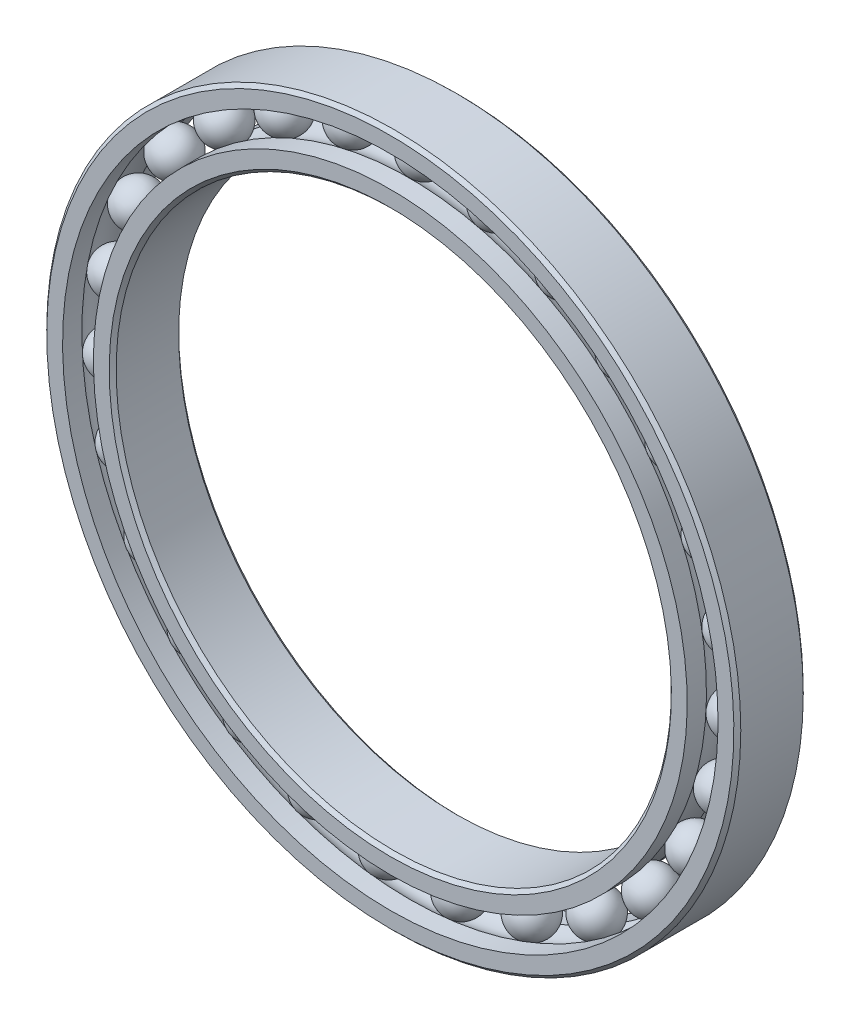
ISO-10303-21;
HEADER;
FILE_DESCRIPTION(('STEP AP214'),'2;1');
FILE_NAME('part.step','',(''),(''),'','','');
FILE_SCHEMA(('AUTOMOTIVE_DESIGN { 1 0 10303 214 1 1 1 1 }'));
ENDSEC;
DATA;
#1=APPLICATION_CONTEXT('core data for automotive mechanical design processes');
#2=APPLICATION_PROTOCOL_DEFINITION('international standard','automotive_design',2000,#1);
#3=PRODUCT_CONTEXT('',#1,'mechanical');
#4=PRODUCT('Part','Part','',(#3));
#5=PRODUCT_RELATED_PRODUCT_CATEGORY('part','',(#4));
#6=PRODUCT_DEFINITION_FORMATION('','',#4);
#7=PRODUCT_DEFINITION_CONTEXT('part definition',#1,'design');
#8=PRODUCT_DEFINITION('design','',#6,#7);
#9=PRODUCT_DEFINITION_SHAPE('','',#8);
#10=(LENGTH_UNIT() NAMED_UNIT(*) SI_UNIT(.MILLI.,.METRE.));
#11=(NAMED_UNIT(*) PLANE_ANGLE_UNIT() SI_UNIT($,.RADIAN.));
#12=(NAMED_UNIT(*) SI_UNIT($,.STERADIAN.) SOLID_ANGLE_UNIT());
#13=UNCERTAINTY_MEASURE_WITH_UNIT(LENGTH_MEASURE(1.E-05),#10,'distance_accuracy_value','');
#14=(GEOMETRIC_REPRESENTATION_CONTEXT(3) GLOBAL_UNCERTAINTY_ASSIGNED_CONTEXT((#13)) GLOBAL_UNIT_ASSIGNED_CONTEXT((#10,
#11,#12)) REPRESENTATION_CONTEXT('',''));
#15=CARTESIAN_POINT('',(0.,0.,0.));
#16=DIRECTION('',(0.,0.,1.));
#17=DIRECTION('',(1.,0.,0.));
#18=AXIS2_PLACEMENT_3D('',#15,#16,#17);
#19=CARTESIAN_POINT('',(10.3777141834092,43.7870191760922,0.));
#20=DIRECTION('',(0.,0.,1.));
#21=DIRECTION('',(0.230615870742427,0.973044870579827,0.));
#22=AXIS2_PLACEMENT_3D('',#19,#20,#21);
#23=SPHERICAL_SURFACE('',#22,3.14269680527354);
#24=CARTESIAN_POINT('',(10.3777141834092,43.7870191760922,3.14269680527354));
#25=VERTEX_POINT('',#24);
#26=VERTEX_LOOP('',#25);
#27=FACE_BOUND('',#26,.T.);
#28=ADVANCED_FACE('F48',(#27),#23,.T.);
#29=CLOSED_SHELL('',(#28));
#30=MANIFOLD_SOLID_BREP('B2',#29);
#31=CARTESIAN_POINT('',(20.1959631090203,40.2134688145538,0.));
#32=DIRECTION('',(0.,0.,1.));
#33=DIRECTION('',(0.448799180200451,0.893632640323418,0.));
#34=AXIS2_PLACEMENT_3D('',#31,#32,#33);
#35=SPHERICAL_SURFACE('',#34,3.14269680527354);
#36=CARTESIAN_POINT('',(20.1959631090203,40.2134688145538,3.14269680527354));
#37=VERTEX_POINT('',#36);
#38=VERTEX_LOOP('',#37);
#39=FACE_BOUND('',#38,.T.);
#40=ADVANCED_FACE('F67',(#39),#35,.T.);
#41=CLOSED_SHELL('',(#40));
#42=MANIFOLD_SOLID_BREP('B6',#41);
#43=CARTESIAN_POINT('',(28.9254424358938,34.4719999403544,0.));
#44=DIRECTION('',(0.,0.,1.));
#45=DIRECTION('',(0.642787609686529,0.766044443118986,0.));
#46=AXIS2_PLACEMENT_3D('',#43,#44,#45);
#47=SPHERICAL_SURFACE('',#46,3.14269680527354);
#48=CARTESIAN_POINT('',(28.9254424358938,34.4719999403544,3.14269680527354));
#49=VERTEX_POINT('',#48);
#50=VERTEX_LOOP('',#49);
#51=FACE_BOUND('',#50,.T.);
#52=ADVANCED_FACE('F86',(#51),#47,.T.);
#53=CLOSED_SHELL('',(#52));
#54=MANIFOLD_SOLID_BREP('B44',#53);
#55=CARTESIAN_POINT('',(36.0955436739766,26.8721366266258,0.));
#56=DIRECTION('',(0.,0.,1.));
#57=DIRECTION('',(0.802123192755037,0.597158591702796,0.));
#58=AXIS2_PLACEMENT_3D('',#55,#56,#57);
#59=SPHERICAL_SURFACE('',#58,3.14269680527354);
#60=CARTESIAN_POINT('',(36.0955436739766,26.8721366266258,3.14269680527354));
#61=VERTEX_POINT('',#60);
#62=VERTEX_LOOP('',#61);
#63=FACE_BOUND('',#62,.T.);
#64=ADVANCED_FACE('F105',(#63),#59,.T.);
#65=CLOSED_SHELL('',(#64));
#66=MANIFOLD_SOLID_BREP('B63',#65);
#67=CARTESIAN_POINT('',(41.3197248096121,17.8235894717625,0.));
#68=DIRECTION('',(0.,0.,1.));
#69=DIRECTION('',(0.91821610688027,0.396079766039167,0.));
#70=AXIS2_PLACEMENT_3D('',#67,#68,#69);
#71=SPHERICAL_SURFACE('',#70,3.14269680527354);
#72=CARTESIAN_POINT('',(41.3197248096121,17.8235894717625,3.14269680527354));
#73=VERTEX_POINT('',#72);
#74=VERTEX_LOOP('',#73);
#75=FACE_BOUND('',#74,.T.);
#76=ADVANCED_FACE('F124',(#75),#71,.T.);
#77=CLOSED_SHELL('',(#76));
#78=MANIFOLD_SOLID_BREP('B82',#77);
#79=CARTESIAN_POINT('',(44.3163488855493,7.81416799501236,0.));
#80=DIRECTION('',(0.,0.,1.));
#81=DIRECTION('',(0.984807753012206,0.173648177666941,0.));
#82=AXIS2_PLACEMENT_3D('',#79,#80,#81);
#83=SPHERICAL_SURFACE('',#82,3.14269680527354);
#84=CARTESIAN_POINT('',(44.3163488855493,7.81416799501236,3.14269680527354));
#85=VERTEX_POINT('',#84);
#86=VERTEX_LOOP('',#85);
#87=FACE_BOUND('',#86,.T.);
#88=ADVANCED_FACE('F143',(#87),#83,.T.);
#89=CLOSED_SHELL('',(#88));
#90=MANIFOLD_SOLID_BREP('B101',#89);
#91=CARTESIAN_POINT('',(44.9238671222071,-2.61651730097095,0.));
#92=DIRECTION('',(0.,0.,1.));
#93=DIRECTION('',(0.998308158271269,-0.0581448289104656,0.));
#94=AXIS2_PLACEMENT_3D('',#91,#92,#93);
#95=SPHERICAL_SURFACE('',#94,3.14269680527354);
#96=CARTESIAN_POINT('',(44.9238671222071,-2.61651730097095,3.14269680527354));
#97=VERTEX_POINT('',#96);
#98=VERTEX_LOOP('',#97);
#99=FACE_BOUND('',#98,.T.);
#100=ADVANCED_FACE('F162',(#99),#95,.T.);
#101=CLOSED_SHELL('',(#100));
#102=MANIFOLD_SOLID_BREP('B120',#101);
#103=CARTESIAN_POINT('',(43.1095280541971,-12.9061454719986,0.));
#104=DIRECTION('',(0.,0.,1.));
#105=DIRECTION('',(0.957989512315492,-0.28680323271108,0.));
#106=AXIS2_PLACEMENT_3D('',#103,#104,#105);
#107=SPHERICAL_SURFACE('',#106,3.14269680527354);
#108=CARTESIAN_POINT('',(43.1095280541971,-12.9061454719986,3.14269680527354));
#109=VERTEX_POINT('',#108);
#110=VERTEX_LOOP('',#109);
#111=FACE_BOUND('',#110,.T.);
#112=ADVANCED_FACE('F181',(#111),#107,.T.);
#113=CLOSED_SHELL('',(#112));
#114=MANIFOLD_SOLID_BREP('B139',#113);
#115=CARTESIAN_POINT('',(38.9711431702999,-22.4999999999996,0.));
#116=DIRECTION('',(0.,0.,1.));
#117=DIRECTION('',(0.866025403784443,-0.499999999999992,0.));
#118=AXIS2_PLACEMENT_3D('',#115,#116,#117);
#119=SPHERICAL_SURFACE('',#118,3.14269680527354);
#120=CARTESIAN_POINT('',(38.9711431702999,-22.4999999999996,3.14269680527353));
#121=VERTEX_POINT('',#120);
#122=VERTEX_LOOP('',#121);
#123=FACE_BOUND('',#122,.T.);
#124=ADVANCED_FACE('F200',(#123),#119,.T.);
#125=CLOSED_SHELL('',(#124));
#126=MANIFOLD_SOLID_BREP('B158',#125);
#127=CARTESIAN_POINT('',(32.7318138707875,-30.8808737040927,0.));
#128=DIRECTION('',(0.,0.,1.));
#129=DIRECTION('',(0.727373641573055,-0.686241637868727,0.));
#130=AXIS2_PLACEMENT_3D('',#127,#128,#129);
#131=SPHERICAL_SURFACE('',#130,3.14269680527354);
#132=CARTESIAN_POINT('',(32.7318138707875,-30.8808737040927,3.14269680527353));
#133=VERTEX_POINT('',#132);
#134=VERTEX_LOOP('',#133);
#135=FACE_BOUND('',#134,.T.);
#136=ADVANCED_FACE('F219',(#135),#131,.T.);
#137=CLOSED_SHELL('',(#136));
#138=MANIFOLD_SOLID_BREP('B177',#137);
#139=CARTESIAN_POINT('',(24.7279040131866,-37.5969515135819,0.));
#140=DIRECTION('',(0.,0.,1.));
#141=DIRECTION('',(0.549508978070813,-0.835487811412932,0.));
#142=AXIS2_PLACEMENT_3D('',#139,#140,#141);
#143=SPHERICAL_SURFACE('',#142,3.14269680527354);
#144=CARTESIAN_POINT('',(24.7279040131866,-37.5969515135819,3.14269680527353));
#145=VERTEX_POINT('',#144);
#146=VERTEX_LOOP('',#145);
#147=FACE_BOUND('',#146,.T.);
#148=ADVANCED_FACE('F240',(#147),#143,.T.);
#149=CLOSED_SHELL('',(#148));
#150=MANIFOLD_SOLID_BREP('B196',#149);
#151=CARTESIAN_POINT('',(15.3909064496554,-42.2861679353658,0.));
#152=DIRECTION('',(0.,0.,1.));
#153=DIRECTION('',(0.342020143325676,-0.939692620785906,0.));
#154=AXIS2_PLACEMENT_3D('',#151,#152,#153);
#155=SPHERICAL_SURFACE('',#154,3.14269680527354);
#156=CARTESIAN_POINT('',(15.3909064496554,-42.2861679353658,3.14269680527353));
#157=VERTEX_POINT('',#156);
#158=VERTEX_LOOP('',#157);
#159=FACE_BOUND('',#158,.T.);
#160=ADVANCED_FACE('F261',(#159),#155,.T.);
#161=CLOSED_SHELL('',(#160));
#162=MANIFOLD_SOLID_BREP('B215',#161);
#163=CARTESIAN_POINT('',(5.22418113563569,-44.6957260983874,0.));
#164=DIRECTION('',(0.,0.,1.));
#165=DIRECTION('',(0.116092914125238,-0.993238357741942,0.));
#166=AXIS2_PLACEMENT_3D('',#163,#164,#165);
#167=SPHERICAL_SURFACE('',#166,3.14269680527354);
#168=CARTESIAN_POINT('',(5.22418113563569,-44.6957260983874,3.14269680527353));
#169=VERTEX_POINT('',#168);
#170=VERTEX_LOOP('',#169);
#171=FACE_BOUND('',#170,.T.);
#172=ADVANCED_FACE('F282',(#171),#167,.T.);
#173=CLOSED_SHELL('',(#172));
#174=MANIFOLD_SOLID_BREP('B236',#173);
#175=CARTESIAN_POINT('',(-5.22418113563505,-44.6957260983875,0.));
#176=DIRECTION('',(0.,0.,1.));
#177=DIRECTION('',(-0.116092914125223,-0.993238357741944,0.));
#178=AXIS2_PLACEMENT_3D('',#175,#176,#177);
#179=SPHERICAL_SURFACE('',#178,3.14269680527354);
#180=CARTESIAN_POINT('',(-5.22418113563505,-44.6957260983875,3.14269680527353));
#181=VERTEX_POINT('',#180);
#182=VERTEX_LOOP('',#181);
#183=FACE_BOUND('',#182,.T.);
#184=ADVANCED_FACE('F303',(#183),#179,.T.);
#185=CLOSED_SHELL('',(#184));
#186=MANIFOLD_SOLID_BREP('B257',#185);
#187=CARTESIAN_POINT('',(-15.3909064496548,-42.286167935366,0.));
#188=DIRECTION('',(0.,0.,1.));
#189=DIRECTION('',(-0.342020143325663,-0.939692620785911,0.));
#190=AXIS2_PLACEMENT_3D('',#187,#188,#189);
#191=SPHERICAL_SURFACE('',#190,3.14269680527354);
#192=CARTESIAN_POINT('',(-15.3909064496548,-42.286167935366,3.14269680527353));
#193=VERTEX_POINT('',#192);
#194=VERTEX_LOOP('',#193);
#195=FACE_BOUND('',#194,.T.);
#196=ADVANCED_FACE('F324',(#195),#191,.T.);
#197=CLOSED_SHELL('',(#196));
#198=MANIFOLD_SOLID_BREP('B278',#197);
#199=CARTESIAN_POINT('',(-24.7279040131861,-37.5969515135823,0.));
#200=DIRECTION('',(0.,0.,1.));
#201=DIRECTION('',(-0.549508978070801,-0.835487811412939,0.));
#202=AXIS2_PLACEMENT_3D('',#199,#200,#201);
#203=SPHERICAL_SURFACE('',#202,3.14269680527354);
#204=CARTESIAN_POINT('',(-24.7279040131861,-37.5969515135823,3.14269680527353));
#205=VERTEX_POINT('',#204);
#206=VERTEX_LOOP('',#205);
#207=FACE_BOUND('',#206,.T.);
#208=ADVANCED_FACE('F345',(#207),#203,.T.);
#209=CLOSED_SHELL('',(#208));
#210=MANIFOLD_SOLID_BREP('B299',#209);
#211=CARTESIAN_POINT('',(-32.731813870787,-30.8808737040932,0.));
#212=DIRECTION('',(0.,0.,1.));
#213=DIRECTION('',(-0.727373641573045,-0.686241637868737,0.));
#214=AXIS2_PLACEMENT_3D('',#211,#212,#213);
#215=SPHERICAL_SURFACE('',#214,3.14269680527354);
#216=CARTESIAN_POINT('',(-32.731813870787,-30.8808737040932,3.14269680527353));
#217=VERTEX_POINT('',#216);
#218=VERTEX_LOOP('',#217);
#219=FACE_BOUND('',#218,.T.);
#220=ADVANCED_FACE('F366',(#219),#215,.T.);
#221=CLOSED_SHELL('',(#220));
#222=MANIFOLD_SOLID_BREP('B320',#221);
#223=CARTESIAN_POINT('',(-38.9711431702996,-22.5000000000002,0.));
#224=DIRECTION('',(0.,0.,1.));
#225=DIRECTION('',(-0.866025403784436,-0.500000000000004,0.));
#226=AXIS2_PLACEMENT_3D('',#223,#224,#225);
#227=SPHERICAL_SURFACE('',#226,3.14269680527354);
#228=CARTESIAN_POINT('',(-38.9711431702996,-22.5000000000002,3.14269680527353));
#229=VERTEX_POINT('',#228);
#230=VERTEX_LOOP('',#229);
#231=FACE_BOUND('',#230,.T.);
#232=ADVANCED_FACE('F387',(#231),#227,.T.);
#233=CLOSED_SHELL('',(#232));
#234=MANIFOLD_SOLID_BREP('B341',#233);
#235=CARTESIAN_POINT('',(-43.109528054197,-12.9061454719992,0.));
#236=DIRECTION('',(0.,0.,1.));
#237=DIRECTION('',(-0.957989512315488,-0.286803232711094,0.));
#238=AXIS2_PLACEMENT_3D('',#235,#236,#237);
#239=SPHERICAL_SURFACE('',#238,3.14269680527354);
#240=CARTESIAN_POINT('',(-43.109528054197,-12.9061454719992,3.14269680527354));
#241=VERTEX_POINT('',#240);
#242=VERTEX_LOOP('',#241);
#243=FACE_BOUND('',#242,.T.);
#244=ADVANCED_FACE('F408',(#243),#239,.T.);
#245=CLOSED_SHELL('',(#244));
#246=MANIFOLD_SOLID_BREP('B362',#245);
#247=CARTESIAN_POINT('',(-44.9238671222071,-2.61651730097158,0.));
#248=DIRECTION('',(0.,0.,1.));
#249=DIRECTION('',(-0.998308158271268,-0.0581448289104796,0.));
#250=AXIS2_PLACEMENT_3D('',#247,#248,#249);
#251=SPHERICAL_SURFACE('',#250,3.14269680527354);
#252=CARTESIAN_POINT('',(-44.9238671222071,-2.61651730097158,3.14269680527354));
#253=VERTEX_POINT('',#252);
#254=VERTEX_LOOP('',#253);
#255=FACE_BOUND('',#254,.T.);
#256=ADVANCED_FACE('F429',(#255),#251,.T.);
#257=CLOSED_SHELL('',(#256));
#258=MANIFOLD_SOLID_BREP('B383',#257);
#259=CARTESIAN_POINT('',(-44.3163488855494,7.81416799501172,0.));
#260=DIRECTION('',(0.,0.,1.));
#261=DIRECTION('',(-0.984807753012209,0.173648177666927,0.));
#262=AXIS2_PLACEMENT_3D('',#259,#260,#261);
#263=SPHERICAL_SURFACE('',#262,3.14269680527354);
#264=CARTESIAN_POINT('',(-44.3163488855494,7.81416799501172,3.14269680527354));
#265=VERTEX_POINT('',#264);
#266=VERTEX_LOOP('',#265);
#267=FACE_BOUND('',#266,.T.);
#268=ADVANCED_FACE('F450',(#267),#263,.T.);
#269=CLOSED_SHELL('',(#268));
#270=MANIFOLD_SOLID_BREP('B404',#269);
#271=CARTESIAN_POINT('',(-41.3197248096124,17.8235894717619,0.));
#272=DIRECTION('',(0.,0.,1.));
#273=DIRECTION('',(-0.918216106880275,0.396079766039154,0.));
#274=AXIS2_PLACEMENT_3D('',#271,#272,#273);
#275=SPHERICAL_SURFACE('',#274,3.14269680527354);
#276=CARTESIAN_POINT('',(-41.3197248096124,17.8235894717619,3.14269680527354));
#277=VERTEX_POINT('',#276);
#278=VERTEX_LOOP('',#277);
#279=FACE_BOUND('',#278,.T.);
#280=ADVANCED_FACE('F471',(#279),#275,.T.);
#281=CLOSED_SHELL('',(#280));
#282=MANIFOLD_SOLID_BREP('B425',#281);
#283=CARTESIAN_POINT('',(-36.095543673977,26.8721366266253,0.));
#284=DIRECTION('',(0.,0.,1.));
#285=DIRECTION('',(-0.802123192755045,0.597158591702785,0.));
#286=AXIS2_PLACEMENT_3D('',#283,#284,#285);
#287=SPHERICAL_SURFACE('',#286,3.14269680527354);
#288=CARTESIAN_POINT('',(-36.095543673977,26.8721366266253,3.14269680527354));
#289=VERTEX_POINT('',#288);
#290=VERTEX_LOOP('',#289);
#291=FACE_BOUND('',#290,.T.);
#292=ADVANCED_FACE('F492',(#291),#287,.T.);
#293=CLOSED_SHELL('',(#292));
#294=MANIFOLD_SOLID_BREP('B446',#293);
#295=CARTESIAN_POINT('',(-28.9254424358943,34.471999940354,0.));
#296=DIRECTION('',(0.,0.,1.));
#297=DIRECTION('',(-0.642787609686541,0.766044443118977,0.));
#298=AXIS2_PLACEMENT_3D('',#295,#296,#297);
#299=SPHERICAL_SURFACE('',#298,3.14269680527354);
#300=CARTESIAN_POINT('',(-28.9254424358943,34.471999940354,3.14269680527354));
#301=VERTEX_POINT('',#300);
#302=VERTEX_LOOP('',#301);
#303=FACE_BOUND('',#302,.T.);
#304=ADVANCED_FACE('F513',(#303),#299,.T.);
#305=CLOSED_SHELL('',(#304));
#306=MANIFOLD_SOLID_BREP('B467',#305);
#307=CARTESIAN_POINT('',(-20.1959631090208,40.2134688145535,0.));
#308=DIRECTION('',(0.,0.,1.));
#309=DIRECTION('',(-0.448799180200463,0.893632640323412,0.));
#310=AXIS2_PLACEMENT_3D('',#307,#308,#309);
#311=SPHERICAL_SURFACE('',#310,3.14269680527354);
#312=CARTESIAN_POINT('',(-20.1959631090208,40.2134688145535,3.14269680527354));
#313=VERTEX_POINT('',#312);
#314=VERTEX_LOOP('',#313);
#315=FACE_BOUND('',#314,.T.);
#316=ADVANCED_FACE('F534',(#315),#311,.T.);
#317=CLOSED_SHELL('',(#316));
#318=MANIFOLD_SOLID_BREP('B488',#317);
#319=CARTESIAN_POINT('',(-10.3777141834098,43.7870191760921,0.));
#320=DIRECTION('',(0.,0.,1.));
#321=DIRECTION('',(-0.230615870742441,0.973044870579824,0.));
#322=AXIS2_PLACEMENT_3D('',#319,#320,#321);
#323=SPHERICAL_SURFACE('',#322,3.14269680527354);
#324=CARTESIAN_POINT('',(-10.3777141834098,43.7870191760921,3.14269680527354));
#325=VERTEX_POINT('',#324);
#326=VERTEX_LOOP('',#325);
#327=FACE_BOUND('',#326,.T.);
#328=ADVANCED_FACE('F555',(#327),#323,.T.);
#329=CLOSED_SHELL('',(#328));
#330=MANIFOLD_SOLID_BREP('B509',#329);
#331=CARTESIAN_POINT('',(0.,45.,0.));
#332=DIRECTION('',(0.,0.,1.));
#333=DIRECTION('',(0.,1.,0.));
#334=AXIS2_PLACEMENT_3D('',#331,#332,#333);
#335=SPHERICAL_SURFACE('',#334,3.14269680527354);
#336=CARTESIAN_POINT('',(0.,45.,3.14269680527354));
#337=VERTEX_POINT('',#336);
#338=VERTEX_LOOP('',#337);
#339=FACE_BOUND('',#338,.T.);
#340=ADVANCED_FACE('F578',(#339),#335,.T.);
#341=CLOSED_SHELL('',(#340));
#342=MANIFOLD_SOLID_BREP('B530',#341);
#343=CARTESIAN_POINT('',(0.,42.7777777777778,5.00000000000003));
#344=DIRECTION('',(0.,0.,-1.));
#345=DIRECTION('',(0.,1.,0.));
#346=AXIS2_PLACEMENT_3D('',#343,#344,#345);
#347=PLANE('',#346);
#348=CARTESIAN_POINT('',(0.,0.,5.00000000000002));
#349=DIRECTION('',(0.,0.,1.));
#350=DIRECTION('',(0.,-1.,0.));
#351=AXIS2_PLACEMENT_3D('',#348,#349,#350);
#352=CIRCLE('',#351,40.5);
#353=CARTESIAN_POINT('',(0.,-40.5,5.00000000000002));
#354=VERTEX_POINT('',#353);
#355=EDGE_CURVE('E626',#354,#354,#352,.T.);
#356=ORIENTED_EDGE('',*,*,#355,.F.);
#357=EDGE_LOOP('',(#356));
#358=FACE_BOUND('',#357,.T.);
#359=CARTESIAN_POINT('',(0.,0.,5.00000000000002));
#360=DIRECTION('',(0.,0.,1.));
#361=DIRECTION('',(0.,-1.,0.));
#362=AXIS2_PLACEMENT_3D('',#359,#360,#361);
#363=CIRCLE('',#362,42.7777777777778);
#364=CARTESIAN_POINT('',(0.,-42.7777777777778,5.00000000000002));
#365=VERTEX_POINT('',#364);
#366=EDGE_CURVE('E577',#365,#365,#363,.T.);
#367=ORIENTED_EDGE('',*,*,#366,.T.);
#368=EDGE_LOOP('',(#367));
#369=FACE_BOUND('',#368,.T.);
#370=ADVANCED_FACE('F598',(#358,#369),#347,.F.);
#371=CARTESIAN_POINT('',(0.,0.,5.00000000000002));
#372=DIRECTION('',(0.,0.,1.));
#373=DIRECTION('',(0.,-1.,0.));
#374=AXIS2_PLACEMENT_3D('',#371,#372,#373);
#375=CYLINDRICAL_SURFACE('',#374,42.7777777777778);
#376=ORIENTED_EDGE('',*,*,#366,.F.);
#377=EDGE_LOOP('',(#376));
#378=FACE_BOUND('',#377,.T.);
#379=CARTESIAN_POINT('',(0.,0.,2.22222222222222));
#380=DIRECTION('',(0.,0.,1.));
#381=DIRECTION('',(0.,-1.,0.));
#382=AXIS2_PLACEMENT_3D('',#379,#380,#381);
#383=CIRCLE('',#382,42.7777777777778);
#384=CARTESIAN_POINT('',(0.,-42.7777777777778,2.22222222222221));
#385=VERTEX_POINT('',#384);
#386=EDGE_CURVE('E604',#385,#385,#383,.T.);
#387=ORIENTED_EDGE('',*,*,#386,.T.);
#388=EDGE_LOOP('',(#387));
#389=FACE_BOUND('',#388,.T.);
#390=ADVANCED_FACE('F633',(#378,#389),#375,.T.);
#391=CARTESIAN_POINT('',(0.,0.,0.));
#392=DIRECTION('',(0.,0.,1.));
#393=DIRECTION('',(0.,-1.,0.));
#394=AXIS2_PLACEMENT_3D('',#391,#392,#393);
#395=TOROIDAL_SURFACE('',#394,45.,3.14269680527354);
#396=ORIENTED_EDGE('',*,*,#386,.F.);
#397=EDGE_LOOP('',(#396));
#398=FACE_BOUND('',#397,.T.);
#399=CARTESIAN_POINT('',(0.,0.,-2.22222222222223));
#400=DIRECTION('',(0.,0.,1.));
#401=DIRECTION('',(0.,-1.,0.));
#402=AXIS2_PLACEMENT_3D('',#399,#400,#401);
#403=CIRCLE('',#402,42.7777777777778);
#404=CARTESIAN_POINT('',(0.,-42.7777777777778,-2.22222222222223));
#405=VERTEX_POINT('',#404);
#406=EDGE_CURVE('E608',#405,#405,#403,.T.);
#407=ORIENTED_EDGE('',*,*,#406,.T.);
#408=EDGE_LOOP('',(#407));
#409=FACE_BOUND('',#408,.T.);
#410=ADVANCED_FACE('F637',(#398,#409),#395,.F.);
#411=CARTESIAN_POINT('',(0.,0.,5.00000000000002));
#412=DIRECTION('',(0.,0.,1.));
#413=DIRECTION('',(0.,-1.,0.));
#414=AXIS2_PLACEMENT_3D('',#411,#412,#413);
#415=CYLINDRICAL_SURFACE('',#414,42.7777777777778);
#416=ORIENTED_EDGE('',*,*,#406,.F.);
#417=EDGE_LOOP('',(#416));
#418=FACE_BOUND('',#417,.T.);
#419=CARTESIAN_POINT('',(0.,0.,-5.00000000000003));
#420=DIRECTION('',(0.,0.,1.));
#421=DIRECTION('',(0.,-1.,0.));
#422=AXIS2_PLACEMENT_3D('',#419,#420,#421);
#423=CIRCLE('',#422,42.7777777777778);
#424=CARTESIAN_POINT('',(0.,-42.7777777777778,-5.00000000000004));
#425=VERTEX_POINT('',#424);
#426=EDGE_CURVE('E612',#425,#425,#423,.T.);
#427=ORIENTED_EDGE('',*,*,#426,.T.);
#428=EDGE_LOOP('',(#427));
#429=FACE_BOUND('',#428,.T.);
#430=ADVANCED_FACE('F642',(#418,#429),#415,.T.);
#431=CARTESIAN_POINT('',(0.,40.5,-5.00000000000003));
#432=DIRECTION('',(0.,0.,1.));
#433=DIRECTION('',(0.,-1.,0.));
#434=AXIS2_PLACEMENT_3D('',#431,#432,#433);
#435=PLANE('',#434);
#436=ORIENTED_EDGE('',*,*,#426,.F.);
#437=EDGE_LOOP('',(#436));
#438=FACE_BOUND('',#437,.T.);
#439=CARTESIAN_POINT('',(0.,0.,-5.00000000000003));
#440=DIRECTION('',(0.,0.,1.));
#441=DIRECTION('',(0.,-1.,0.));
#442=AXIS2_PLACEMENT_3D('',#439,#440,#441);
#443=CIRCLE('',#442,40.5);
#444=CARTESIAN_POINT('',(0.,-40.5,-5.00000000000004));
#445=VERTEX_POINT('',#444);
#446=EDGE_CURVE('E617',#445,#445,#443,.T.);
#447=ORIENTED_EDGE('',*,*,#446,.T.);
#448=EDGE_LOOP('',(#447));
#449=FACE_BOUND('',#448,.T.);
#450=ADVANCED_FACE('F648',(#438,#449),#435,.F.);
#451=CARTESIAN_POINT('',(0.,0.,-4.50000000000002));
#452=DIRECTION('',(0.,0.,-1.));
#453=DIRECTION('',(0.,1.,0.));
#454=AXIS2_PLACEMENT_3D('',#451,#452,#453);
#455=CONICAL_SURFACE('',#454,40.,0.785398163397417);
#456=ORIENTED_EDGE('',*,*,#446,.F.);
#457=EDGE_LOOP('',(#456));
#458=FACE_BOUND('',#457,.T.);
#459=CARTESIAN_POINT('',(0.,0.,-4.50000000000002));
#460=DIRECTION('',(0.,0.,1.));
#461=DIRECTION('',(0.,-1.,0.));
#462=AXIS2_PLACEMENT_3D('',#459,#460,#461);
#463=CIRCLE('',#462,40.);
#464=CARTESIAN_POINT('',(0.,-40.,-4.50000000000003));
#465=VERTEX_POINT('',#464);
#466=EDGE_CURVE('E620',#465,#465,#463,.T.);
#467=ORIENTED_EDGE('',*,*,#466,.T.);
#468=EDGE_LOOP('',(#467));
#469=FACE_BOUND('',#468,.T.);
#470=ADVANCED_FACE('F652',(#458,#469),#455,.F.);
#471=CARTESIAN_POINT('',(0.,0.,5.00000000000002));
#472=DIRECTION('',(0.,0.,1.));
#473=DIRECTION('',(0.,-1.,0.));
#474=AXIS2_PLACEMENT_3D('',#471,#472,#473);
#475=CYLINDRICAL_SURFACE('',#474,40.);
#476=ORIENTED_EDGE('',*,*,#466,.F.);
#477=EDGE_LOOP('',(#476));
#478=FACE_BOUND('',#477,.T.);
#479=CARTESIAN_POINT('',(0.,0.,4.50000000000004));
#480=DIRECTION('',(0.,0.,1.));
#481=DIRECTION('',(0.,-1.,0.));
#482=AXIS2_PLACEMENT_3D('',#479,#480,#481);
#483=CIRCLE('',#482,40.);
#484=CARTESIAN_POINT('',(0.,-40.,4.50000000000004));
#485=VERTEX_POINT('',#484);
#486=EDGE_CURVE('E623',#485,#485,#483,.T.);
#487=ORIENTED_EDGE('',*,*,#486,.T.);
#488=EDGE_LOOP('',(#487));
#489=FACE_BOUND('',#488,.T.);
#490=ADVANCED_FACE('F656',(#478,#489),#475,.F.);
#491=CARTESIAN_POINT('',(0.,0.,5.00000000000002));
#492=DIRECTION('',(0.,0.,1.));
#493=DIRECTION('',(0.,-1.,0.));
#494=AXIS2_PLACEMENT_3D('',#491,#492,#493);
#495=CONICAL_SURFACE('',#494,40.5,0.785398163397481);
#496=ORIENTED_EDGE('',*,*,#486,.F.);
#497=EDGE_LOOP('',(#496));
#498=FACE_BOUND('',#497,.T.);
#499=ORIENTED_EDGE('',*,*,#355,.T.);
#500=EDGE_LOOP('',(#499));
#501=FACE_BOUND('',#500,.T.);
#502=ADVANCED_FACE('F630',(#498,#501),#495,.F.);
#503=CLOSED_SHELL('',(#370,#390,#410,#430,#450,#470,#490,#502));
#504=MANIFOLD_SOLID_BREP('B551',#503);
#505=CARTESIAN_POINT('',(0.,0.,4.50000000000001));
#506=DIRECTION('',(0.,0.,-1.));
#507=DIRECTION('',(0.,1.,0.));
#508=AXIS2_PLACEMENT_3D('',#505,#506,#507);
#509=CONICAL_SURFACE('',#508,50.,0.785398163397442);
#510=CARTESIAN_POINT('',(0.,0.,5.00000000000001));
#511=DIRECTION('',(0.,0.,1.));
#512=DIRECTION('',(0.,-1.,0.));
#513=AXIS2_PLACEMENT_3D('',#510,#511,#512);
#514=CIRCLE('',#513,49.5);
#515=CARTESIAN_POINT('',(0.,-49.5,5.));
#516=VERTEX_POINT('',#515);
#517=EDGE_CURVE('E748',#516,#516,#514,.T.);
#518=ORIENTED_EDGE('',*,*,#517,.F.);
#519=EDGE_LOOP('',(#518));
#520=FACE_BOUND('',#519,.T.);
#521=CARTESIAN_POINT('',(0.,0.,4.50000000000001));
#522=DIRECTION('',(0.,0.,1.));
#523=DIRECTION('',(0.,-1.,0.));
#524=AXIS2_PLACEMENT_3D('',#521,#522,#523);
#525=CIRCLE('',#524,50.);
#526=CARTESIAN_POINT('',(0.,-50.,4.5));
#527=VERTEX_POINT('',#526);
#528=EDGE_CURVE('E597',#527,#527,#525,.T.);
#529=ORIENTED_EDGE('',*,*,#528,.T.);
#530=EDGE_LOOP('',(#529));
#531=FACE_BOUND('',#530,.T.);
#532=ADVANCED_FACE('F720',(#520,#531),#509,.T.);
#533=CARTESIAN_POINT('',(0.,0.,5.00000000000002));
#534=DIRECTION('',(0.,0.,1.));
#535=DIRECTION('',(0.,-1.,0.));
#536=AXIS2_PLACEMENT_3D('',#533,#534,#535);
#537=CYLINDRICAL_SURFACE('',#536,50.);
#538=ORIENTED_EDGE('',*,*,#528,.F.);
#539=EDGE_LOOP('',(#538));
#540=FACE_BOUND('',#539,.T.);
#541=CARTESIAN_POINT('',(0.,0.,-4.50000000000002));
#542=DIRECTION('',(0.,0.,1.));
#543=DIRECTION('',(0.,-1.,0.));
#544=AXIS2_PLACEMENT_3D('',#541,#542,#543);
#545=CIRCLE('',#544,50.);
#546=CARTESIAN_POINT('',(0.,-50.,-4.50000000000003));
#547=VERTEX_POINT('',#546);
#548=EDGE_CURVE('E726',#547,#547,#545,.T.);
#549=ORIENTED_EDGE('',*,*,#548,.T.);
#550=EDGE_LOOP('',(#549));
#551=FACE_BOUND('',#550,.T.);
#552=ADVANCED_FACE('F755',(#540,#551),#537,.T.);
#553=CARTESIAN_POINT('',(0.,0.,-5.00000000000002));
#554=DIRECTION('',(0.,0.,1.));
#555=DIRECTION('',(0.,-1.,0.));
#556=AXIS2_PLACEMENT_3D('',#553,#554,#555);
#557=CONICAL_SURFACE('',#556,49.5,0.785398163397443);
#558=ORIENTED_EDGE('',*,*,#548,.F.);
#559=EDGE_LOOP('',(#558));
#560=FACE_BOUND('',#559,.T.);
#561=CARTESIAN_POINT('',(0.,0.,-5.00000000000002));
#562=DIRECTION('',(0.,0.,1.));
#563=DIRECTION('',(0.,-1.,0.));
#564=AXIS2_PLACEMENT_3D('',#561,#562,#563);
#565=CIRCLE('',#564,49.5);
#566=CARTESIAN_POINT('',(0.,-49.5,-5.00000000000003));
#567=VERTEX_POINT('',#566);
#568=EDGE_CURVE('E730',#567,#567,#565,.T.);
#569=ORIENTED_EDGE('',*,*,#568,.T.);
#570=EDGE_LOOP('',(#569));
#571=FACE_BOUND('',#570,.T.);
#572=ADVANCED_FACE('F759',(#560,#571),#557,.T.);
#573=CARTESIAN_POINT('',(0.,49.5,-5.00000000000002));
#574=DIRECTION('',(0.,0.,1.));
#575=DIRECTION('',(0.,-1.,0.));
#576=AXIS2_PLACEMENT_3D('',#573,#574,#575);
#577=PLANE('',#576);
#578=ORIENTED_EDGE('',*,*,#568,.F.);
#579=EDGE_LOOP('',(#578));
#580=FACE_BOUND('',#579,.T.);
#581=CARTESIAN_POINT('',(0.,0.,-5.00000000000003));
#582=DIRECTION('',(0.,0.,1.));
#583=DIRECTION('',(0.,-1.,0.));
#584=AXIS2_PLACEMENT_3D('',#581,#582,#583);
#585=CIRCLE('',#584,47.2222222222222);
#586=CARTESIAN_POINT('',(0.,-47.2222222222222,-5.00000000000003));
#587=VERTEX_POINT('',#586);
#588=EDGE_CURVE('E734',#587,#587,#585,.T.);
#589=ORIENTED_EDGE('',*,*,#588,.T.);
#590=EDGE_LOOP('',(#589));
#591=FACE_BOUND('',#590,.T.);
#592=ADVANCED_FACE('F764',(#580,#591),#577,.F.);
#593=CARTESIAN_POINT('',(0.,0.,5.00000000000002));
#594=DIRECTION('',(0.,0.,1.));
#595=DIRECTION('',(0.,-1.,0.));
#596=AXIS2_PLACEMENT_3D('',#593,#594,#595);
#597=CYLINDRICAL_SURFACE('',#596,47.2222222222222);
#598=ORIENTED_EDGE('',*,*,#588,.F.);
#599=EDGE_LOOP('',(#598));
#600=FACE_BOUND('',#599,.T.);
#601=CARTESIAN_POINT('',(0.,0.,-2.22222222222223));
#602=DIRECTION('',(0.,0.,1.));
#603=DIRECTION('',(0.,-1.,0.));
#604=AXIS2_PLACEMENT_3D('',#601,#602,#603);
#605=CIRCLE('',#604,47.2222222222222);
#606=CARTESIAN_POINT('',(0.,-47.2222222222222,-2.22222222222224));
#607=VERTEX_POINT('',#606);
#608=EDGE_CURVE('E739',#607,#607,#605,.T.);
#609=ORIENTED_EDGE('',*,*,#608,.T.);
#610=EDGE_LOOP('',(#609));
#611=FACE_BOUND('',#610,.T.);
#612=ADVANCED_FACE('F770',(#600,#611),#597,.F.);
#613=CARTESIAN_POINT('',(0.,0.,0.));
#614=DIRECTION('',(0.,0.,1.));
#615=DIRECTION('',(0.,-1.,0.));
#616=AXIS2_PLACEMENT_3D('',#613,#614,#615);
#617=TOROIDAL_SURFACE('',#616,45.,3.14269680527354);
#618=ORIENTED_EDGE('',*,*,#608,.F.);
#619=EDGE_LOOP('',(#618));
#620=FACE_BOUND('',#619,.T.);
#621=CARTESIAN_POINT('',(0.,0.,2.22222222222221));
#622=DIRECTION('',(0.,0.,1.));
#623=DIRECTION('',(0.,-1.,0.));
#624=AXIS2_PLACEMENT_3D('',#621,#622,#623);
#625=CIRCLE('',#624,47.2222222222222);
#626=CARTESIAN_POINT('',(0.,-47.2222222222222,2.22222222222221));
#627=VERTEX_POINT('',#626);
#628=EDGE_CURVE('E742',#627,#627,#625,.T.);
#629=ORIENTED_EDGE('',*,*,#628,.T.);
#630=EDGE_LOOP('',(#629));
#631=FACE_BOUND('',#630,.T.);
#632=ADVANCED_FACE('F774',(#620,#631),#617,.F.);
#633=CARTESIAN_POINT('',(0.,0.,5.00000000000002));
#634=DIRECTION('',(0.,0.,1.));
#635=DIRECTION('',(0.,-1.,0.));
#636=AXIS2_PLACEMENT_3D('',#633,#634,#635);
#637=CYLINDRICAL_SURFACE('',#636,47.2222222222222);
#638=ORIENTED_EDGE('',*,*,#628,.F.);
#639=EDGE_LOOP('',(#638));
#640=FACE_BOUND('',#639,.T.);
#641=CARTESIAN_POINT('',(0.,0.,5.00000000000001));
#642=DIRECTION('',(0.,0.,1.));
#643=DIRECTION('',(0.,-1.,0.));
#644=AXIS2_PLACEMENT_3D('',#641,#642,#643);
#645=CIRCLE('',#644,47.2222222222222);
#646=CARTESIAN_POINT('',(0.,-47.2222222222222,5.00000000000001));
#647=VERTEX_POINT('',#646);
#648=EDGE_CURVE('E745',#647,#647,#645,.T.);
#649=ORIENTED_EDGE('',*,*,#648,.T.);
#650=EDGE_LOOP('',(#649));
#651=FACE_BOUND('',#650,.T.);
#652=ADVANCED_FACE('F778',(#640,#651),#637,.F.);
#653=CARTESIAN_POINT('',(0.,49.5,5.00000000000002));
#654=DIRECTION('',(0.,0.,-1.));
#655=DIRECTION('',(0.,1.,0.));
#656=AXIS2_PLACEMENT_3D('',#653,#654,#655);
#657=PLANE('',#656);
#658=ORIENTED_EDGE('',*,*,#648,.F.);
#659=EDGE_LOOP('',(#658));
#660=FACE_BOUND('',#659,.T.);
#661=ORIENTED_EDGE('',*,*,#517,.T.);
#662=EDGE_LOOP('',(#661));
#663=FACE_BOUND('',#662,.T.);
#664=ADVANCED_FACE('F752',(#660,#663),#657,.F.);
#665=CLOSED_SHELL('',(#532,#552,#572,#592,#612,#632,#652,#664));
#666=MANIFOLD_SOLID_BREP('B572',#665);
#667=ADVANCED_BREP_SHAPE_REPRESENTATION('',(#18,#30,#42,#54,#66,#78,#90,#102,#114,#126,#138,
#150,#162,#174,#186,#198,#210,#222,#234,#246,#258,#270,#282,#294,#306,#318,#330,#342,#504,#666),#14);
#668=SHAPE_DEFINITION_REPRESENTATION(#9,#667);
ENDSEC;
END-ISO-10303-21;
